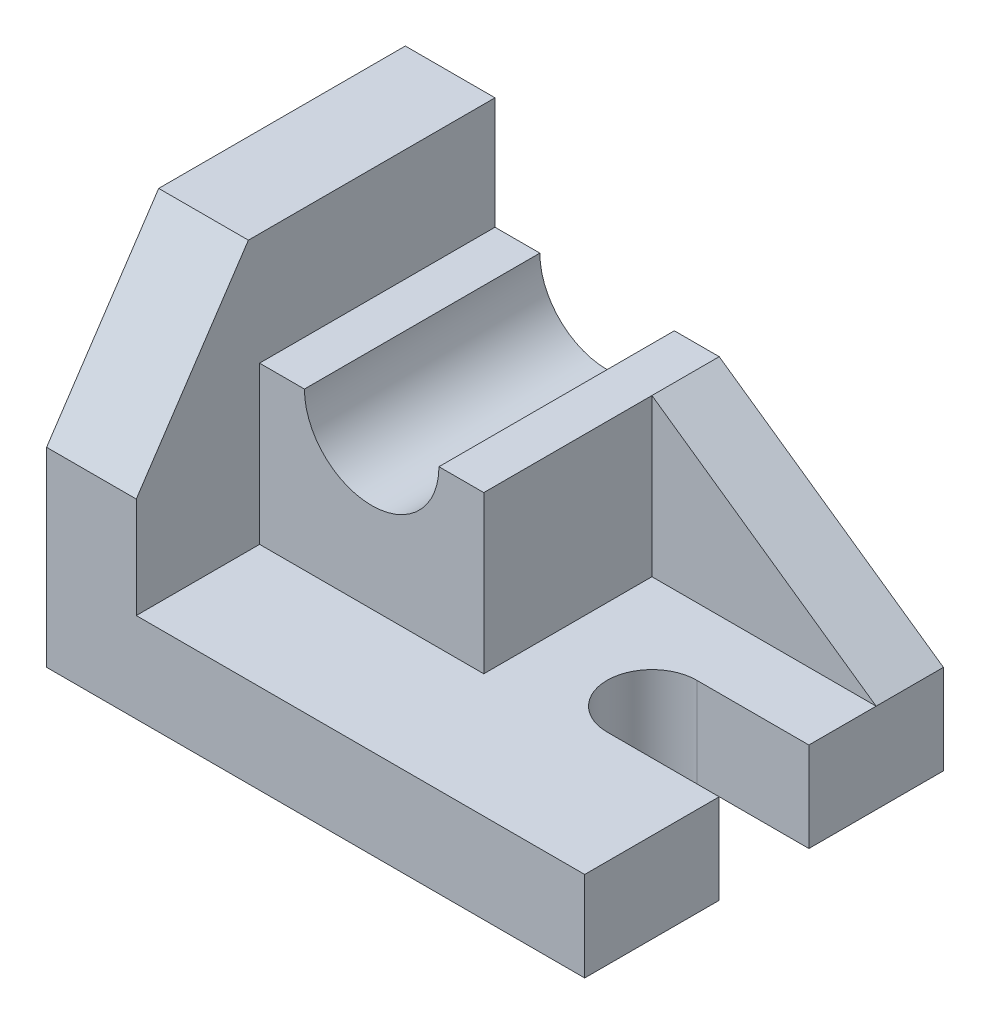
ISO-10303-21;
HEADER;
FILE_DESCRIPTION(('STEP AP214'),'2;1');
FILE_NAME('part.step','',(''),(''),'','','');
FILE_SCHEMA(('AUTOMOTIVE_DESIGN { 1 0 10303 214 1 1 1 1 }'));
ENDSEC;
DATA;
#1=APPLICATION_CONTEXT('core data for automotive mechanical design processes');
#2=APPLICATION_PROTOCOL_DEFINITION('international standard','automotive_design',2000,#1);
#3=PRODUCT_CONTEXT('',#1,'mechanical');
#4=PRODUCT('Part','Part','',(#3));
#5=PRODUCT_RELATED_PRODUCT_CATEGORY('part','',(#4));
#6=PRODUCT_DEFINITION_FORMATION('','',#4);
#7=PRODUCT_DEFINITION_CONTEXT('part definition',#1,'design');
#8=PRODUCT_DEFINITION('design','',#6,#7);
#9=PRODUCT_DEFINITION_SHAPE('','',#8);
#10=(LENGTH_UNIT() NAMED_UNIT(*) SI_UNIT(.MILLI.,.METRE.));
#11=(NAMED_UNIT(*) PLANE_ANGLE_UNIT() SI_UNIT($,.RADIAN.));
#12=(NAMED_UNIT(*) SI_UNIT($,.STERADIAN.) SOLID_ANGLE_UNIT());
#13=UNCERTAINTY_MEASURE_WITH_UNIT(LENGTH_MEASURE(1.E-05),#10,'distance_accuracy_value','');
#14=(GEOMETRIC_REPRESENTATION_CONTEXT(3) GLOBAL_UNCERTAINTY_ASSIGNED_CONTEXT((#13)) GLOBAL_UNIT_ASSIGNED_CONTEXT((#10,
#11,#12)) REPRESENTATION_CONTEXT('',''));
#15=CARTESIAN_POINT('',(0.,0.,0.));
#16=DIRECTION('',(0.,0.,1.));
#17=DIRECTION('',(1.,0.,0.));
#18=AXIS2_PLACEMENT_3D('',#15,#16,#17);
#19=CARTESIAN_POINT('',(953.669850724664,510.439468864253,-916.84391645062));
#20=DIRECTION('',(-1.,0.,0.));
#21=DIRECTION('',(0.,0.,1.));
#22=AXIS2_PLACEMENT_3D('',#19,#20,#21);
#23=PLANE('',#22);
#24=DIRECTION('',(0.,0.,1.));
#25=VECTOR('',#24,1.);
#26=CARTESIAN_POINT('',(953.669850724664,510.439468864253,-956.843916450621));
#27=LINE('',#26,#25);
#28=CARTESIAN_POINT('',(953.669850724664,510.439468864253,-940.84391645062));
#29=VERTEX_POINT('',#28);
#30=CARTESIAN_POINT('',(953.669850724664,510.439468864253,-928.84391645062));
#31=VERTEX_POINT('',#30);
#32=EDGE_CURVE('E156',#29,#31,#27,.T.);
#33=ORIENTED_EDGE('',*,*,#32,.T.);
#34=DIRECTION('',(0.,0.,-1.));
#35=VECTOR('',#34,1.);
#36=CARTESIAN_POINT('',(953.669850724664,510.439468864253,-916.84391645062));
#37=LINE('',#36,#35);
#38=CARTESIAN_POINT('',(953.669850724664,510.439468864253,-916.84391645062));
#39=VERTEX_POINT('',#38);
#40=EDGE_CURVE('E166',#39,#31,#37,.T.);
#41=ORIENTED_EDGE('',*,*,#40,.F.);
#42=DIRECTION('',(0.,-1.,0.));
#43=VECTOR('',#42,1.);
#44=CARTESIAN_POINT('',(953.669850724664,510.439468864253,-916.84391645062));
#45=LINE('',#44,#43);
#46=CARTESIAN_POINT('',(953.669850724664,494.439468864253,-916.84391645062));
#47=VERTEX_POINT('',#46);
#48=EDGE_CURVE('E212',#39,#47,#45,.T.);
#49=ORIENTED_EDGE('',*,*,#48,.T.);
#50=DIRECTION('',(0.,0.,-1.));
#51=VECTOR('',#50,1.);
#52=CARTESIAN_POINT('',(953.669850724664,494.439468864253,-916.84391645062));
#53=LINE('',#52,#51);
#54=CARTESIAN_POINT('',(953.669850724664,494.439468864253,-940.84391645062));
#55=VERTEX_POINT('',#54);
#56=EDGE_CURVE('E206',#47,#55,#53,.T.);
#57=ORIENTED_EDGE('',*,*,#56,.T.);
#58=DIRECTION('',(0.,-1.,0.));
#59=VECTOR('',#58,1.);
#60=CARTESIAN_POINT('',(953.669850724664,510.439468864253,-940.84391645062));
#61=LINE('',#60,#59);
#62=EDGE_CURVE('E168',#29,#55,#61,.T.);
#63=ORIENTED_EDGE('',*,*,#62,.F.);
#64=EDGE_LOOP('',(#33,#41,#49,#57,#63));
#65=FACE_BOUND('',#64,.T.);
#66=ADVANCED_FACE('F36',(#65),#23,.F.);
#67=CARTESIAN_POINT('',(857.669850724664,510.439468864253,-940.84391645062));
#68=DIRECTION('',(0.,0.,1.));
#69=DIRECTION('',(1.,0.,0.));
#70=AXIS2_PLACEMENT_3D('',#67,#68,#69);
#71=PLANE('',#70);
#72=DIRECTION('',(-0.81923192051904,0.573462344363328,0.));
#73=VECTOR('',#72,1.);
#74=CARTESIAN_POINT('',(889.240320523321,555.540140005193,-940.84391645062));
#75=LINE('',#74,#73);
#76=CARTESIAN_POINT('',(913.669850724664,538.439468864253,-940.84391645062));
#77=VERTEX_POINT('',#76);
#78=EDGE_CURVE('E51',#29,#77,#75,.T.);
#79=ORIENTED_EDGE('',*,*,#78,.F.);
#80=ORIENTED_EDGE('',*,*,#62,.T.);
#81=DIRECTION('',(-1.,0.,0.));
#82=VECTOR('',#81,1.);
#83=CARTESIAN_POINT('',(857.669850724664,494.439468864253,-940.84391645062));
#84=LINE('',#83,#82);
#85=CARTESIAN_POINT('',(857.669850724664,494.439468864253,-940.84391645062));
#86=VERTEX_POINT('',#85);
#87=EDGE_CURVE('E208',#55,#86,#84,.T.);
#88=ORIENTED_EDGE('',*,*,#87,.T.);
#89=DIRECTION('',(0.,-1.,0.));
#90=VECTOR('',#89,1.);
#91=CARTESIAN_POINT('',(857.669850724664,510.439468864253,-940.84391645062));
#92=LINE('',#91,#90);
#93=CARTESIAN_POINT('',(857.669850724664,558.439468864253,-940.84391645062));
#94=VERTEX_POINT('',#93);
#95=EDGE_CURVE('E184',#94,#86,#92,.T.);
#96=ORIENTED_EDGE('',*,*,#95,.F.);
#97=DIRECTION('',(-1.,0.,0.));
#98=VECTOR('',#97,1.);
#99=CARTESIAN_POINT('',(857.669850724664,558.439468864253,-940.84391645062));
#100=LINE('',#99,#98);
#101=CARTESIAN_POINT('',(873.669850724664,558.439468864253,-940.84391645062));
#102=VERTEX_POINT('',#101);
#103=EDGE_CURVE('E277',#102,#94,#100,.T.);
#104=ORIENTED_EDGE('',*,*,#103,.F.);
#105=DIRECTION('',(0.,-1.,0.));
#106=VECTOR('',#105,1.);
#107=CARTESIAN_POINT('',(873.669850724664,558.439468864253,-940.84391645062));
#108=LINE('',#107,#106);
#109=CARTESIAN_POINT('',(873.669850724664,538.439468864253,-940.84391645062));
#110=VERTEX_POINT('',#109);
#111=EDGE_CURVE('E280',#102,#110,#108,.T.);
#112=ORIENTED_EDGE('',*,*,#111,.T.);
#113=DIRECTION('',(-1.,0.,0.));
#114=VECTOR('',#113,1.);
#115=CARTESIAN_POINT('',(857.669850724664,538.439468864253,-940.84391645062));
#116=LINE('',#115,#114);
#117=CARTESIAN_POINT('',(881.669850724664,538.439468864253,-940.84391645062));
#118=VERTEX_POINT('',#117);
#119=EDGE_CURVE('E317',#118,#110,#116,.T.);
#120=ORIENTED_EDGE('',*,*,#119,.F.);
#121=CARTESIAN_POINT('',(893.669850724664,538.439468864253,-940.84391645062));
#122=DIRECTION('',(0.,0.,1.));
#123=DIRECTION('',(1.,0.,0.));
#124=AXIS2_PLACEMENT_3D('',#121,#122,#123);
#125=CIRCLE('',#124,12.);
#126=CARTESIAN_POINT('',(905.669850724664,538.439468864253,-940.84391645062));
#127=VERTEX_POINT('',#126);
#128=EDGE_CURVE('E235',#118,#127,#125,.T.);
#129=ORIENTED_EDGE('',*,*,#128,.T.);
#130=EDGE_CURVE('E321',#77,#127,#116,.T.);
#131=ORIENTED_EDGE('',*,*,#130,.F.);
#132=EDGE_LOOP('',(#79,#80,#88,#96,#104,#112,#120,#129,#131));
#133=FACE_BOUND('',#132,.T.);
#134=ADVANCED_FACE('F307',(#133),#71,.F.);
#135=CARTESIAN_POINT('',(857.669850724664,538.439468864253,-928.84391645062));
#136=DIRECTION('',(0.,0.,-1.));
#137=DIRECTION('',(-1.,0.,0.));
#138=AXIS2_PLACEMENT_3D('',#135,#136,#137);
#139=PLANE('',#138);
#140=DIRECTION('',(-0.81923192051904,0.573462344363328,0.));
#141=VECTOR('',#140,1.);
#142=CARTESIAN_POINT('',(896.757099046811,550.27839503875,-928.84391645062));
#143=LINE('',#142,#141);
#144=CARTESIAN_POINT('',(913.669850724664,538.439468864253,-928.84391645062));
#145=VERTEX_POINT('',#144);
#146=EDGE_CURVE('E153',#31,#145,#143,.T.);
#147=ORIENTED_EDGE('',*,*,#146,.T.);
#148=DIRECTION('',(0.,-1.,0.));
#149=VECTOR('',#148,1.);
#150=CARTESIAN_POINT('',(913.669850724664,538.439468864253,-928.84391645062));
#151=LINE('',#150,#149);
#152=CARTESIAN_POINT('',(913.669850724664,510.439468864253,-928.84391645062));
#153=VERTEX_POINT('',#152);
#154=EDGE_CURVE('E173',#145,#153,#151,.T.);
#155=ORIENTED_EDGE('',*,*,#154,.T.);
#156=DIRECTION('',(1.,0.,0.));
#157=VECTOR('',#156,1.);
#158=CARTESIAN_POINT('',(857.669850724664,510.439468864253,-928.84391645062));
#159=LINE('',#158,#157);
#160=EDGE_CURVE('E171',#153,#31,#159,.T.);
#161=ORIENTED_EDGE('',*,*,#160,.T.);
#162=EDGE_LOOP('',(#147,#155,#161));
#163=FACE_BOUND('',#162,.T.);
#164=ADVANCED_FACE('F172',(#163),#139,.F.);
#165=CARTESIAN_POINT('',(857.669850724664,538.439468864253,-876.843916450621));
#166=DIRECTION('',(0.,1.,0.));
#167=DIRECTION('',(0.,0.,1.));
#168=AXIS2_PLACEMENT_3D('',#165,#166,#167);
#169=PLANE('',#168);
#170=DIRECTION('',(0.,0.,1.));
#171=VECTOR('',#170,1.);
#172=CARTESIAN_POINT('',(913.669850724664,538.439468864253,-876.843916450621));
#173=LINE('',#172,#171);
#174=CARTESIAN_POINT('',(913.669850724664,538.439468864253,-898.843916450621));
#175=VERTEX_POINT('',#174);
#176=EDGE_CURVE('E260',#145,#175,#173,.T.);
#177=ORIENTED_EDGE('',*,*,#176,.F.);
#178=DIRECTION('',(0.,0.,-1.));
#179=VECTOR('',#178,1.);
#180=CARTESIAN_POINT('',(913.669850724664,538.439468864253,-876.843916450621));
#181=LINE('',#180,#179);
#182=EDGE_CURVE('E11',#145,#77,#181,.T.);
#183=ORIENTED_EDGE('',*,*,#182,.T.);
#184=ORIENTED_EDGE('',*,*,#130,.T.);
#185=DIRECTION('',(0.,0.,1.));
#186=VECTOR('',#185,1.);
#187=CARTESIAN_POINT('',(905.669850724664,538.439468864253,-940.84391645062));
#188=LINE('',#187,#186);
#189=CARTESIAN_POINT('',(905.669850724664,538.439468864253,-898.843916450621));
#190=VERTEX_POINT('',#189);
#191=EDGE_CURVE('E231',#190,#127,#188,.F.);
#192=ORIENTED_EDGE('',*,*,#191,.F.);
#193=DIRECTION('',(1.,0.,0.));
#194=VECTOR('',#193,1.);
#195=CARTESIAN_POINT('',(857.669850724664,538.439468864253,-898.843916450621));
#196=LINE('',#195,#194);
#197=EDGE_CURVE('E246',#190,#175,#196,.T.);
#198=ORIENTED_EDGE('',*,*,#197,.T.);
#199=EDGE_LOOP('',(#177,#183,#184,#192,#198));
#200=FACE_BOUND('',#199,.T.);
#201=ADVANCED_FACE('F331',(#200),#169,.T.);
#202=DIRECTION('',(0.,0.,1.));
#203=VECTOR('',#202,1.);
#204=CARTESIAN_POINT('',(881.669850724664,538.439468864253,-940.84391645062));
#205=LINE('',#204,#203);
#206=CARTESIAN_POINT('',(881.669850724664,538.439468864253,-898.843916450621));
#207=VERTEX_POINT('',#206);
#208=EDGE_CURVE('E44',#118,#207,#205,.T.);
#209=ORIENTED_EDGE('',*,*,#208,.F.);
#210=ORIENTED_EDGE('',*,*,#119,.T.);
#211=DIRECTION('',(0.,0.,1.));
#212=VECTOR('',#211,1.);
#213=CARTESIAN_POINT('',(873.669850724664,538.439468864253,-876.843916450621));
#214=LINE('',#213,#212);
#215=CARTESIAN_POINT('',(873.669850724664,538.439468864253,-898.843916450621));
#216=VERTEX_POINT('',#215);
#217=EDGE_CURVE('E250',#110,#216,#214,.T.);
#218=ORIENTED_EDGE('',*,*,#217,.T.);
#219=EDGE_CURVE('E243',#216,#207,#196,.T.);
#220=ORIENTED_EDGE('',*,*,#219,.T.);
#221=EDGE_LOOP('',(#209,#210,#218,#220));
#222=FACE_BOUND('',#221,.T.);
#223=ADVANCED_FACE('F248',(#222),#169,.T.);
#224=CARTESIAN_POINT('',(873.669850724664,558.439468864253,-940.84391645062));
#225=DIRECTION('',(-1.,0.,0.));
#226=DIRECTION('',(0.,0.,1.));
#227=AXIS2_PLACEMENT_3D('',#224,#225,#226);
#228=PLANE('',#227);
#229=DIRECTION('',(0.,-1.,0.));
#230=VECTOR('',#229,1.);
#231=CARTESIAN_POINT('',(873.669850724664,538.439468864253,-898.843916450621));
#232=LINE('',#231,#230);
#233=CARTESIAN_POINT('',(873.669850724664,510.439468864253,-898.843916450621));
#234=VERTEX_POINT('',#233);
#235=EDGE_CURVE('E253',#216,#234,#232,.T.);
#236=ORIENTED_EDGE('',*,*,#235,.F.);
#237=ORIENTED_EDGE('',*,*,#217,.F.);
#238=ORIENTED_EDGE('',*,*,#111,.F.);
#239=DIRECTION('',(0.,0.,-1.));
#240=VECTOR('',#239,1.);
#241=CARTESIAN_POINT('',(873.669850724664,558.439468864253,-940.84391645062));
#242=LINE('',#241,#240);
#243=CARTESIAN_POINT('',(873.669850724664,558.439468864253,-896.843916450621));
#244=VERTEX_POINT('',#243);
#245=EDGE_CURVE('E275',#244,#102,#242,.T.);
#246=ORIENTED_EDGE('',*,*,#245,.F.);
#247=DIRECTION('',(0.,0.832050294337844,-0.554700196225229));
#248=VECTOR('',#247,1.);
#249=CARTESIAN_POINT('',(873.669850724664,578.747161171945,-910.382377989082));
#250=LINE('',#249,#248);
#251=CARTESIAN_POINT('',(873.669850724664,528.439468864253,-876.843916450621));
#252=VERTEX_POINT('',#251);
#253=EDGE_CURVE('E267',#252,#244,#250,.T.);
#254=ORIENTED_EDGE('',*,*,#253,.F.);
#255=DIRECTION('',(0.,-1.,0.));
#256=VECTOR('',#255,1.);
#257=CARTESIAN_POINT('',(873.669850724664,558.439468864253,-876.843916450621));
#258=LINE('',#257,#256);
#259=CARTESIAN_POINT('',(873.669850724664,510.439468864253,-876.843916450621));
#260=VERTEX_POINT('',#259);
#261=EDGE_CURVE('E196',#252,#260,#258,.T.);
#262=ORIENTED_EDGE('',*,*,#261,.T.);
#263=DIRECTION('',(0.,0.,-1.));
#264=VECTOR('',#263,1.);
#265=CARTESIAN_POINT('',(873.669850724664,510.439468864253,-940.84391645062));
#266=LINE('',#265,#264);
#267=EDGE_CURVE('E271',#260,#234,#266,.T.);
#268=ORIENTED_EDGE('',*,*,#267,.T.);
#269=EDGE_LOOP('',(#236,#237,#238,#246,#254,#262,#268));
#270=FACE_BOUND('',#269,.T.);
#271=ADVANCED_FACE('F319',(#270),#228,.F.);
#272=CARTESIAN_POINT('',(933.669850724664,510.439468864253,-908.843916450621));
#273=DIRECTION('',(0.,1.,0.));
#274=DIRECTION('',(0.,0.,1.));
#275=AXIS2_PLACEMENT_3D('',#272,#273,#274);
#276=PLANE('',#275);
#277=ORIENTED_EDGE('',*,*,#40,.T.);
#278=ORIENTED_EDGE('',*,*,#160,.F.);
#279=DIRECTION('',(0.,0.,1.));
#280=VECTOR('',#279,1.);
#281=CARTESIAN_POINT('',(913.669850724664,510.439468864253,-876.843916450621));
#282=LINE('',#281,#280);
#283=CARTESIAN_POINT('',(913.669850724664,510.439468864253,-898.843916450621));
#284=VERTEX_POINT('',#283);
#285=EDGE_CURVE('E178',#153,#284,#282,.T.);
#286=ORIENTED_EDGE('',*,*,#285,.T.);
#287=DIRECTION('',(1.,0.,0.));
#288=VECTOR('',#287,1.);
#289=CARTESIAN_POINT('',(857.669850724664,510.439468864253,-898.843916450621));
#290=LINE('',#289,#288);
#291=EDGE_CURVE('E177',#234,#284,#290,.T.);
#292=ORIENTED_EDGE('',*,*,#291,.F.);
#293=ORIENTED_EDGE('',*,*,#267,.F.);
#294=DIRECTION('',(1.,0.,0.));
#295=VECTOR('',#294,1.);
#296=CARTESIAN_POINT('',(857.669850724664,510.439468864253,-876.843916450621));
#297=LINE('',#296,#295);
#298=CARTESIAN_POINT('',(953.669850724664,510.439468864253,-876.843916450621));
#299=VERTEX_POINT('',#298);
#300=EDGE_CURVE('E209',#260,#299,#297,.T.);
#301=ORIENTED_EDGE('',*,*,#300,.T.);
#302=DIRECTION('',(0.,0.,-1.));
#303=VECTOR('',#302,1.);
#304=CARTESIAN_POINT('',(953.669850724664,510.439468864253,-876.843916450621));
#305=LINE('',#304,#303);
#306=CARTESIAN_POINT('',(953.669850724664,510.439468864253,-900.843916450621));
#307=VERTEX_POINT('',#306);
#308=EDGE_CURVE('E287',#299,#307,#305,.T.);
#309=ORIENTED_EDGE('',*,*,#308,.T.);
#310=DIRECTION('',(-1.,0.,0.));
#311=VECTOR('',#310,1.);
#312=CARTESIAN_POINT('',(933.669850724664,510.439468864253,-900.843916450621));
#313=LINE('',#312,#311);
#314=CARTESIAN_POINT('',(933.669850724664,510.439468864253,-900.843916450621));
#315=VERTEX_POINT('',#314);
#316=EDGE_CURVE('E289',#307,#315,#313,.T.);
#317=ORIENTED_EDGE('',*,*,#316,.T.);
#318=CARTESIAN_POINT('',(933.669850724664,510.439468864253,-908.843916450621));
#319=DIRECTION('',(0.,-1.,0.));
#320=DIRECTION('',(0.,0.,1.));
#321=AXIS2_PLACEMENT_3D('',#318,#319,#320);
#322=CIRCLE('',#321,8.);
#323=CARTESIAN_POINT('',(933.669850724664,510.439468864253,-916.84391645062));
#324=VERTEX_POINT('',#323);
#325=EDGE_CURVE('E188',#315,#324,#322,.T.);
#326=ORIENTED_EDGE('',*,*,#325,.T.);
#327=DIRECTION('',(1.,0.,0.));
#328=VECTOR('',#327,1.);
#329=CARTESIAN_POINT('',(933.669850724664,510.439468864253,-916.84391645062));
#330=LINE('',#329,#328);
#331=EDGE_CURVE('E182',#324,#39,#330,.T.);
#332=ORIENTED_EDGE('',*,*,#331,.T.);
#333=EDGE_LOOP('',(#277,#278,#286,#292,#293,#301,#309,#317,#326,#332));
#334=FACE_BOUND('',#333,.T.);
#335=ADVANCED_FACE('F180',(#334),#276,.T.);
#336=CARTESIAN_POINT('',(857.669850724664,510.439468864253,-876.843916450621));
#337=DIRECTION('',(1.,0.,0.));
#338=DIRECTION('',(0.,0.,-1.));
#339=AXIS2_PLACEMENT_3D('',#336,#337,#338);
#340=PLANE('',#339);
#341=DIRECTION('',(0.,-0.832050294337844,0.554700196225229));
#342=VECTOR('',#341,1.);
#343=CARTESIAN_POINT('',(857.669850724664,515.977930402715,-868.536224142928));
#344=LINE('',#343,#342);
#345=CARTESIAN_POINT('',(857.669850724664,558.439468864253,-896.843916450621));
#346=VERTEX_POINT('',#345);
#347=CARTESIAN_POINT('',(857.669850724664,528.439468864253,-876.843916450621));
#348=VERTEX_POINT('',#347);
#349=EDGE_CURVE('E269',#346,#348,#344,.T.);
#350=ORIENTED_EDGE('',*,*,#349,.F.);
#351=DIRECTION('',(0.,0.,1.));
#352=VECTOR('',#351,1.);
#353=CARTESIAN_POINT('',(857.669850724664,558.439468864253,-940.84391645062));
#354=LINE('',#353,#352);
#355=EDGE_CURVE('E272',#94,#346,#354,.T.);
#356=ORIENTED_EDGE('',*,*,#355,.F.);
#357=ORIENTED_EDGE('',*,*,#95,.T.);
#358=DIRECTION('',(0.,0.,1.));
#359=VECTOR('',#358,1.);
#360=CARTESIAN_POINT('',(857.669850724664,494.439468864253,-876.843916450621));
#361=LINE('',#360,#359);
#362=CARTESIAN_POINT('',(857.669850724664,494.439468864253,-876.843916450621));
#363=VERTEX_POINT('',#362);
#364=EDGE_CURVE('E192',#86,#363,#361,.T.);
#365=ORIENTED_EDGE('',*,*,#364,.T.);
#366=DIRECTION('',(0.,-1.,0.));
#367=VECTOR('',#366,1.);
#368=CARTESIAN_POINT('',(857.669850724664,510.439468864253,-876.843916450621));
#369=LINE('',#368,#367);
#370=EDGE_CURVE('E226',#348,#363,#369,.T.);
#371=ORIENTED_EDGE('',*,*,#370,.F.);
#372=EDGE_LOOP('',(#350,#356,#357,#365,#371));
#373=FACE_BOUND('',#372,.T.);
#374=ADVANCED_FACE('F38',(#373),#340,.F.);
#375=CARTESIAN_POINT('',(857.669850724664,510.439468864253,-876.843916450621));
#376=DIRECTION('',(0.,0.,-1.));
#377=DIRECTION('',(-1.,0.,0.));
#378=AXIS2_PLACEMENT_3D('',#375,#376,#377);
#379=PLANE('',#378);
#380=DIRECTION('',(-1.,0.,0.));
#381=VECTOR('',#380,1.);
#382=CARTESIAN_POINT('',(953.669850724664,528.439468864253,-876.843916450621));
#383=LINE('',#382,#381);
#384=EDGE_CURVE('E264',#252,#348,#383,.T.);
#385=ORIENTED_EDGE('',*,*,#384,.T.);
#386=ORIENTED_EDGE('',*,*,#370,.T.);
#387=DIRECTION('',(1.,0.,0.));
#388=VECTOR('',#387,1.);
#389=CARTESIAN_POINT('',(857.669850724664,494.439468864253,-876.843916450621));
#390=LINE('',#389,#388);
#391=CARTESIAN_POINT('',(953.669850724664,494.439468864253,-876.843916450621));
#392=VERTEX_POINT('',#391);
#393=EDGE_CURVE('E195',#363,#392,#390,.T.);
#394=ORIENTED_EDGE('',*,*,#393,.T.);
#395=DIRECTION('',(0.,-1.,0.));
#396=VECTOR('',#395,1.);
#397=CARTESIAN_POINT('',(953.669850724664,510.439468864253,-876.843916450621));
#398=LINE('',#397,#396);
#399=EDGE_CURVE('E223',#299,#392,#398,.T.);
#400=ORIENTED_EDGE('',*,*,#399,.F.);
#401=ORIENTED_EDGE('',*,*,#300,.F.);
#402=ORIENTED_EDGE('',*,*,#261,.F.);
#403=EDGE_LOOP('',(#385,#386,#394,#400,#401,#402));
#404=FACE_BOUND('',#403,.T.);
#405=ADVANCED_FACE('F337',(#404),#379,.F.);
#406=CARTESIAN_POINT('',(857.669850724664,558.439468864253,-876.843916450621));
#407=DIRECTION('',(0.,1.,0.));
#408=DIRECTION('',(0.,0.,1.));
#409=AXIS2_PLACEMENT_3D('',#406,#407,#408);
#410=PLANE('',#409);
#411=ORIENTED_EDGE('',*,*,#355,.T.);
#412=DIRECTION('',(1.,0.,0.));
#413=VECTOR('',#412,1.);
#414=CARTESIAN_POINT('',(857.669850724664,558.439468864253,-896.843916450621));
#415=LINE('',#414,#413);
#416=EDGE_CURVE('E228',#346,#244,#415,.T.);
#417=ORIENTED_EDGE('',*,*,#416,.T.);
#418=ORIENTED_EDGE('',*,*,#245,.T.);
#419=ORIENTED_EDGE('',*,*,#103,.T.);
#420=EDGE_LOOP('',(#411,#417,#418,#419));
#421=FACE_BOUND('',#420,.T.);
#422=ADVANCED_FACE('F314',(#421),#410,.T.);
#423=CARTESIAN_POINT('',(953.669850724664,510.439468864253,-876.843916450621));
#424=DIRECTION('',(-1.,0.,0.));
#425=DIRECTION('',(0.,0.,1.));
#426=AXIS2_PLACEMENT_3D('',#423,#424,#425);
#427=PLANE('',#426);
#428=DIRECTION('',(0.,0.,-1.));
#429=VECTOR('',#428,1.);
#430=CARTESIAN_POINT('',(953.669850724664,494.439468864253,-876.843916450621));
#431=LINE('',#430,#429);
#432=CARTESIAN_POINT('',(953.669850724664,494.439468864253,-900.843916450621));
#433=VERTEX_POINT('',#432);
#434=EDGE_CURVE('E198',#392,#433,#431,.T.);
#435=ORIENTED_EDGE('',*,*,#434,.T.);
#436=DIRECTION('',(0.,-1.,0.));
#437=VECTOR('',#436,1.);
#438=CARTESIAN_POINT('',(953.669850724664,510.439468864253,-900.843916450621));
#439=LINE('',#438,#437);
#440=EDGE_CURVE('E220',#307,#433,#439,.T.);
#441=ORIENTED_EDGE('',*,*,#440,.F.);
#442=ORIENTED_EDGE('',*,*,#308,.F.);
#443=ORIENTED_EDGE('',*,*,#399,.T.);
#444=EDGE_LOOP('',(#435,#441,#442,#443));
#445=FACE_BOUND('',#444,.T.);
#446=ADVANCED_FACE('F342',(#445),#427,.F.);
#447=CARTESIAN_POINT('',(933.669850724664,510.439468864253,-900.843916450621));
#448=DIRECTION('',(0.,0.,1.));
#449=DIRECTION('',(1.,0.,0.));
#450=AXIS2_PLACEMENT_3D('',#447,#448,#449);
#451=PLANE('',#450);
#452=DIRECTION('',(-1.,0.,0.));
#453=VECTOR('',#452,1.);
#454=CARTESIAN_POINT('',(933.669850724664,494.439468864253,-900.843916450621));
#455=LINE('',#454,#453);
#456=CARTESIAN_POINT('',(933.669850724664,494.439468864253,-900.843916450621));
#457=VERTEX_POINT('',#456);
#458=EDGE_CURVE('E200',#433,#457,#455,.T.);
#459=ORIENTED_EDGE('',*,*,#458,.T.);
#460=DIRECTION('',(0.,-1.,0.));
#461=VECTOR('',#460,1.);
#462=CARTESIAN_POINT('',(933.669850724664,510.439468864253,-900.843916450621));
#463=LINE('',#462,#461);
#464=EDGE_CURVE('E217',#315,#457,#463,.T.);
#465=ORIENTED_EDGE('',*,*,#464,.F.);
#466=ORIENTED_EDGE('',*,*,#316,.F.);
#467=ORIENTED_EDGE('',*,*,#440,.T.);
#468=EDGE_LOOP('',(#459,#465,#466,#467));
#469=FACE_BOUND('',#468,.T.);
#470=ADVANCED_FACE('F346',(#469),#451,.F.);
#471=CARTESIAN_POINT('',(933.669850724664,510.439468864253,-908.843916450621));
#472=DIRECTION('',(0.,-1.,0.));
#473=DIRECTION('',(0.,0.,-1.));
#474=AXIS2_PLACEMENT_3D('',#471,#472,#473);
#475=CYLINDRICAL_SURFACE('',#474,8.);
#476=CARTESIAN_POINT('',(933.669850724664,494.439468864253,-908.843916450621));
#477=DIRECTION('',(0.,-1.,0.));
#478=DIRECTION('',(0.,0.,1.));
#479=AXIS2_PLACEMENT_3D('',#476,#477,#478);
#480=CIRCLE('',#479,8.);
#481=CARTESIAN_POINT('',(933.669850724664,494.439468864253,-916.84391645062));
#482=VERTEX_POINT('',#481);
#483=EDGE_CURVE('E202',#457,#482,#480,.T.);
#484=ORIENTED_EDGE('',*,*,#483,.T.);
#485=DIRECTION('',(0.,-1.,0.));
#486=VECTOR('',#485,1.);
#487=CARTESIAN_POINT('',(933.669850724664,510.439468864253,-916.84391645062));
#488=LINE('',#487,#486);
#489=EDGE_CURVE('E214',#324,#482,#488,.T.);
#490=ORIENTED_EDGE('',*,*,#489,.F.);
#491=ORIENTED_EDGE('',*,*,#325,.F.);
#492=ORIENTED_EDGE('',*,*,#464,.T.);
#493=EDGE_LOOP('',(#484,#490,#491,#492));
#494=FACE_BOUND('',#493,.T.);
#495=ADVANCED_FACE('F295',(#494),#475,.F.);
#496=CARTESIAN_POINT('',(933.669850724664,510.439468864253,-916.84391645062));
#497=DIRECTION('',(0.,0.,-1.));
#498=DIRECTION('',(-1.,0.,0.));
#499=AXIS2_PLACEMENT_3D('',#496,#497,#498);
#500=PLANE('',#499);
#501=DIRECTION('',(1.,0.,0.));
#502=VECTOR('',#501,1.);
#503=CARTESIAN_POINT('',(933.669850724664,494.439468864253,-916.84391645062));
#504=LINE('',#503,#502);
#505=EDGE_CURVE('E204',#482,#47,#504,.T.);
#506=ORIENTED_EDGE('',*,*,#505,.T.);
#507=ORIENTED_EDGE('',*,*,#48,.F.);
#508=ORIENTED_EDGE('',*,*,#331,.F.);
#509=ORIENTED_EDGE('',*,*,#489,.T.);
#510=EDGE_LOOP('',(#506,#507,#508,#509));
#511=FACE_BOUND('',#510,.T.);
#512=ADVANCED_FACE('F299',(#511),#500,.F.);
#513=CARTESIAN_POINT('',(933.669850724664,494.439468864253,-908.843916450621));
#514=DIRECTION('',(0.,1.,0.));
#515=DIRECTION('',(0.,0.,1.));
#516=AXIS2_PLACEMENT_3D('',#513,#514,#515);
#517=PLANE('',#516);
#518=ORIENTED_EDGE('',*,*,#364,.F.);
#519=ORIENTED_EDGE('',*,*,#87,.F.);
#520=ORIENTED_EDGE('',*,*,#56,.F.);
#521=ORIENTED_EDGE('',*,*,#505,.F.);
#522=ORIENTED_EDGE('',*,*,#483,.F.);
#523=ORIENTED_EDGE('',*,*,#458,.F.);
#524=ORIENTED_EDGE('',*,*,#434,.F.);
#525=ORIENTED_EDGE('',*,*,#393,.F.);
#526=EDGE_LOOP('',(#518,#519,#520,#521,#522,#523,#524,#525));
#527=FACE_BOUND('',#526,.T.);
#528=ADVANCED_FACE('F304',(#527),#517,.F.);
#529=CARTESIAN_POINT('',(953.669850724664,504.901007325791,-861.151608758313));
#530=DIRECTION('',(0.,0.554700196225229,0.832050294337844));
#531=DIRECTION('',(0.,-0.832050294337844,0.554700196225229));
#532=AXIS2_PLACEMENT_3D('',#529,#530,#531);
#533=PLANE('',#532);
#534=ORIENTED_EDGE('',*,*,#349,.T.);
#535=ORIENTED_EDGE('',*,*,#384,.F.);
#536=ORIENTED_EDGE('',*,*,#253,.T.);
#537=ORIENTED_EDGE('',*,*,#416,.F.);
#538=EDGE_LOOP('',(#534,#535,#536,#537));
#539=FACE_BOUND('',#538,.T.);
#540=ADVANCED_FACE('F367',(#539),#533,.T.);
#541=CARTESIAN_POINT('',(913.669850724664,538.439468864253,-876.843916450621));
#542=DIRECTION('',(1.,0.,0.));
#543=DIRECTION('',(0.,0.,-1.));
#544=AXIS2_PLACEMENT_3D('',#541,#542,#543);
#545=PLANE('',#544);
#546=ORIENTED_EDGE('',*,*,#285,.F.);
#547=ORIENTED_EDGE('',*,*,#154,.F.);
#548=ORIENTED_EDGE('',*,*,#176,.T.);
#549=DIRECTION('',(0.,-1.,0.));
#550=VECTOR('',#549,1.);
#551=CARTESIAN_POINT('',(913.669850724664,538.439468864253,-898.843916450621));
#552=LINE('',#551,#550);
#553=EDGE_CURVE('E251',#175,#284,#552,.T.);
#554=ORIENTED_EDGE('',*,*,#553,.T.);
#555=EDGE_LOOP('',(#546,#547,#548,#554));
#556=FACE_BOUND('',#555,.T.);
#557=ADVANCED_FACE('F330',(#556),#545,.T.);
#558=CARTESIAN_POINT('',(857.669850724664,538.439468864253,-898.843916450621));
#559=DIRECTION('',(0.,0.,-1.));
#560=DIRECTION('',(-1.,0.,0.));
#561=AXIS2_PLACEMENT_3D('',#558,#559,#560);
#562=PLANE('',#561);
#563=ORIENTED_EDGE('',*,*,#197,.F.);
#564=CARTESIAN_POINT('',(893.669850724664,538.439468864253,-898.843916450621));
#565=DIRECTION('',(0.,0.,1.));
#566=DIRECTION('',(1.,0.,0.));
#567=AXIS2_PLACEMENT_3D('',#564,#565,#566);
#568=CIRCLE('',#567,12.);
#569=EDGE_CURVE('E58',#207,#190,#568,.T.);
#570=ORIENTED_EDGE('',*,*,#569,.F.);
#571=ORIENTED_EDGE('',*,*,#219,.F.);
#572=ORIENTED_EDGE('',*,*,#235,.T.);
#573=ORIENTED_EDGE('',*,*,#291,.T.);
#574=ORIENTED_EDGE('',*,*,#553,.F.);
#575=EDGE_LOOP('',(#563,#570,#571,#572,#573,#574));
#576=FACE_BOUND('',#575,.T.);
#577=ADVANCED_FACE('F242',(#576),#562,.F.);
#578=CARTESIAN_POINT('',(893.669850724664,538.439468864253,-940.84391645062));
#579=DIRECTION('',(0.,0.,1.));
#580=DIRECTION('',(1.,0.,0.));
#581=AXIS2_PLACEMENT_3D('',#578,#579,#580);
#582=CYLINDRICAL_SURFACE('',#581,12.);
#583=ORIENTED_EDGE('',*,*,#208,.T.);
#584=ORIENTED_EDGE('',*,*,#569,.T.);
#585=ORIENTED_EDGE('',*,*,#191,.T.);
#586=ORIENTED_EDGE('',*,*,#128,.F.);
#587=EDGE_LOOP('',(#583,#584,#585,#586));
#588=FACE_BOUND('',#587,.T.);
#589=ADVANCED_FACE('F233',(#588),#582,.F.);
#590=CARTESIAN_POINT('',(896.757099046811,550.27839503875,-956.843916450621));
#591=DIRECTION('',(0.573462344363328,0.81923192051904,0.));
#592=DIRECTION('',(-0.81923192051904,0.573462344363328,0.));
#593=AXIS2_PLACEMENT_3D('',#590,#591,#592);
#594=PLANE('',#593);
#595=ORIENTED_EDGE('',*,*,#78,.T.);
#596=ORIENTED_EDGE('',*,*,#182,.F.);
#597=ORIENTED_EDGE('',*,*,#146,.F.);
#598=ORIENTED_EDGE('',*,*,#32,.F.);
#599=EDGE_LOOP('',(#595,#596,#597,#598));
#600=FACE_BOUND('',#599,.T.);
#601=ADVANCED_FACE('F155',(#600),#594,.T.);
#602=CLOSED_SHELL('',(#66,#134,#164,#201,#223,#271,#335,#374,#405,#422,#446,#470,#495,#512,#528,
#540,#557,#577,#589,#601));
#603=MANIFOLD_SOLID_BREP('B2',#602);
#604=ADVANCED_BREP_SHAPE_REPRESENTATION('',(#18,#603),#14);
#605=SHAPE_DEFINITION_REPRESENTATION(#9,#604);
ENDSEC;
END-ISO-10303-21;
